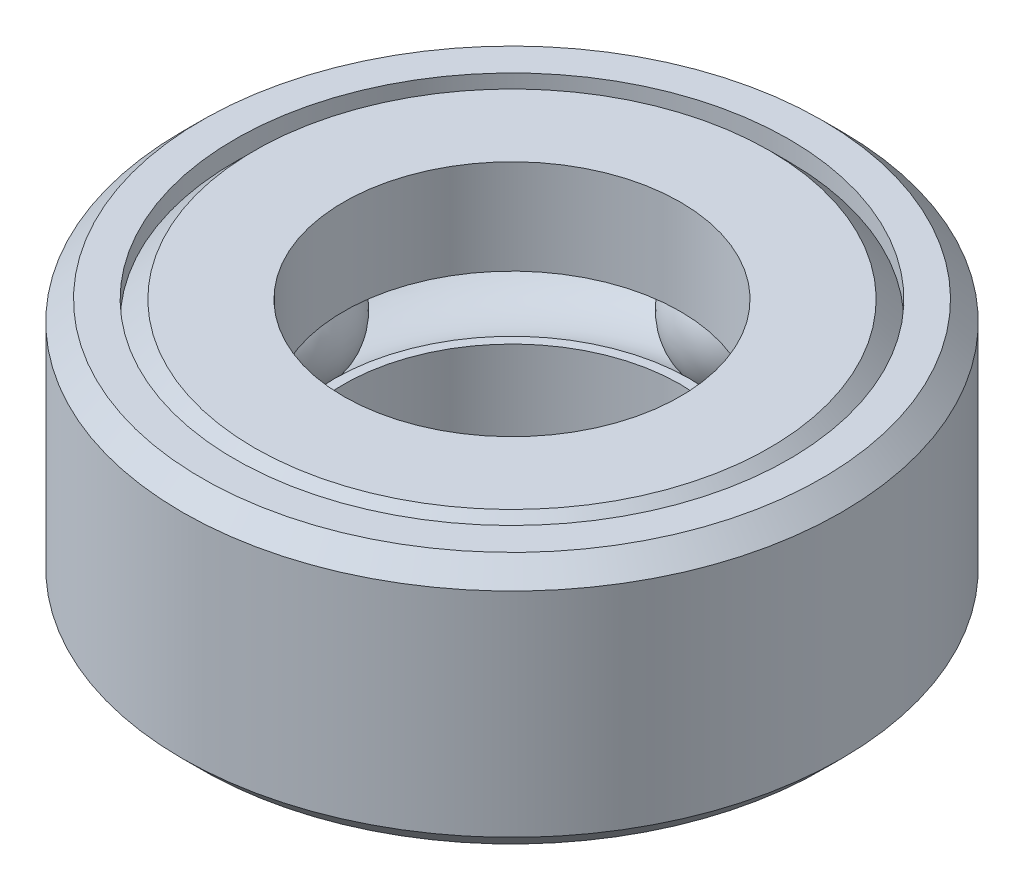
ISO-10303-21;
HEADER;
FILE_DESCRIPTION(('STEP AP214'),'2;1');
FILE_NAME('part.step','',(''),(''),'','','');
FILE_SCHEMA(('AUTOMOTIVE_DESIGN { 1 0 10303 214 1 1 1 1 }'));
ENDSEC;
DATA;
#1=APPLICATION_CONTEXT('core data for automotive mechanical design processes');
#2=APPLICATION_PROTOCOL_DEFINITION('international standard','automotive_design',2000,#1);
#3=PRODUCT_CONTEXT('',#1,'mechanical');
#4=PRODUCT('Part','Part','',(#3));
#5=PRODUCT_RELATED_PRODUCT_CATEGORY('part','',(#4));
#6=PRODUCT_DEFINITION_FORMATION('','',#4);
#7=PRODUCT_DEFINITION_CONTEXT('part definition',#1,'design');
#8=PRODUCT_DEFINITION('design','',#6,#7);
#9=PRODUCT_DEFINITION_SHAPE('','',#8);
#10=(LENGTH_UNIT() NAMED_UNIT(*) SI_UNIT(.MILLI.,.METRE.));
#11=(NAMED_UNIT(*) PLANE_ANGLE_UNIT() SI_UNIT($,.RADIAN.));
#12=(NAMED_UNIT(*) SI_UNIT($,.STERADIAN.) SOLID_ANGLE_UNIT());
#13=UNCERTAINTY_MEASURE_WITH_UNIT(LENGTH_MEASURE(1.E-05),#10,'distance_accuracy_value','');
#14=(GEOMETRIC_REPRESENTATION_CONTEXT(3) GLOBAL_UNCERTAINTY_ASSIGNED_CONTEXT((#13)) GLOBAL_UNIT_ASSIGNED_CONTEXT((#10,
#11,#12)) REPRESENTATION_CONTEXT('',''));
#15=CARTESIAN_POINT('',(0.,0.,0.));
#16=DIRECTION('',(0.,0.,1.));
#17=DIRECTION('',(1.,0.,0.));
#18=AXIS2_PLACEMENT_3D('',#15,#16,#17);
#19=CARTESIAN_POINT('',(13.15640625,0.,1.37806040724343E-13));
#20=DIRECTION('',(0.,1.,0.));
#21=DIRECTION('',(-1.,0.,0.));
#22=AXIS2_PLACEMENT_3D('',#19,#20,#21);
#23=SPHERICAL_SURFACE('',#22,3.571875);
#24=CARTESIAN_POINT('',(13.15640625,3.571875,1.38243469252913E-13));
#25=VERTEX_POINT('',#24);
#26=VERTEX_LOOP('',#25);
#27=FACE_BOUND('',#26,.T.);
#28=ADVANCED_FACE('F44',(#27),#23,.T.);
#29=CLOSED_SHELL('',(#28));
#30=MANIFOLD_SOLID_BREP('B2',#29);
#31=CARTESIAN_POINT('',(0.,0.,-13.15640625));
#32=DIRECTION('',(0.,1.,0.));
#33=DIRECTION('',(0.,0.,1.));
#34=AXIS2_PLACEMENT_3D('',#31,#32,#33);
#35=SPHERICAL_SURFACE('',#34,3.571875);
#36=CARTESIAN_POINT('',(0.,3.571875,-13.15640625));
#37=VERTEX_POINT('',#36);
#38=VERTEX_LOOP('',#37);
#39=FACE_BOUND('',#38,.T.);
#40=ADVANCED_FACE('F63',(#39),#35,.T.);
#41=CLOSED_SHELL('',(#40));
#42=MANIFOLD_SOLID_BREP('B6',#41);
#43=CARTESIAN_POINT('',(-13.15640625,0.,0.));
#44=DIRECTION('',(0.,1.,0.));
#45=DIRECTION('',(1.,0.,0.));
#46=AXIS2_PLACEMENT_3D('',#43,#44,#45);
#47=SPHERICAL_SURFACE('',#46,3.571875);
#48=CARTESIAN_POINT('',(-13.15640625,3.571875,0.));
#49=VERTEX_POINT('',#48);
#50=VERTEX_LOOP('',#49);
#51=FACE_BOUND('',#50,.T.);
#52=ADVANCED_FACE('F82',(#51),#47,.T.);
#53=CLOSED_SHELL('',(#52));
#54=MANIFOLD_SOLID_BREP('B40',#53);
#55=CARTESIAN_POINT('',(0.,0.,13.15640625));
#56=DIRECTION('',(0.,1.,0.));
#57=DIRECTION('',(0.,0.,-1.));
#58=AXIS2_PLACEMENT_3D('',#55,#56,#57);
#59=SPHERICAL_SURFACE('',#58,3.571875);
#60=CARTESIAN_POINT('',(0.,3.571875,13.15640625));
#61=VERTEX_POINT('',#60);
#62=VERTEX_LOOP('',#61);
#63=FACE_BOUND('',#62,.T.);
#64=ADVANCED_FACE('F103',(#63),#59,.T.);
#65=CLOSED_SHELL('',(#64));
#66=MANIFOLD_SOLID_BREP('B59',#65);
#67=CARTESIAN_POINT('',(0.,4.92447139784791,0.));
#68=DIRECTION('',(0.,-1.,0.));
#69=DIRECTION('',(0.,0.,-1.));
#70=AXIS2_PLACEMENT_3D('',#67,#68,#69);
#71=CONICAL_SURFACE('',#70,16.7878125,0.78539816339745);
#72=CARTESIAN_POINT('',(0.,6.03411069892395,0.));
#73=DIRECTION('',(0.,-1.,0.));
#74=DIRECTION('',(0.,0.,-1.));
#75=AXIS2_PLACEMENT_3D('',#72,#73,#74);
#76=CIRCLE('',#75,15.678173198924);
#77=CARTESIAN_POINT('',(0.,6.03411069892396,-15.678173198924));
#78=VERTEX_POINT('',#77);
#79=EDGE_CURVE('E102',#78,#78,#76,.T.);
#80=ORIENTED_EDGE('',*,*,#79,.F.);
#81=EDGE_LOOP('',(#80));
#82=FACE_BOUND('',#81,.T.);
#83=CARTESIAN_POINT('',(0.,4.92447139784791,0.));
#84=DIRECTION('',(0.,-1.,0.));
#85=DIRECTION('',(0.,0.,-1.));
#86=AXIS2_PLACEMENT_3D('',#83,#84,#85);
#87=CIRCLE('',#86,16.7878125);
#88=CARTESIAN_POINT('',(0.,4.92447139784791,-16.7878125));
#89=VERTEX_POINT('',#88);
#90=EDGE_CURVE('E167',#89,#89,#87,.T.);
#91=ORIENTED_EDGE('',*,*,#90,.T.);
#92=EDGE_LOOP('',(#91));
#93=FACE_BOUND('',#92,.T.);
#94=ADVANCED_FACE('F124',(#82,#93),#71,.F.);
#95=CARTESIAN_POINT('',(0.,-7.14375000000001,0.));
#96=DIRECTION('',(0.,-1.,0.));
#97=DIRECTION('',(0.,0.,-1.));
#98=AXIS2_PLACEMENT_3D('',#95,#96,#97);
#99=CYLINDRICAL_SURFACE('',#98,15.678173198924);
#100=CARTESIAN_POINT('',(0.,7.14375,0.));
#101=DIRECTION('',(0.,-1.,0.));
#102=DIRECTION('',(0.,0.,-1.));
#103=AXIS2_PLACEMENT_3D('',#100,#101,#102);
#104=CIRCLE('',#103,15.6781731989239);
#105=CARTESIAN_POINT('',(0.,7.14375,-15.6781731989239));
#106=VERTEX_POINT('',#105);
#107=EDGE_CURVE('E131',#106,#106,#104,.T.);
#108=ORIENTED_EDGE('',*,*,#107,.F.);
#109=EDGE_LOOP('',(#108));
#110=FACE_BOUND('',#109,.T.);
#111=ORIENTED_EDGE('',*,*,#79,.T.);
#112=EDGE_LOOP('',(#111));
#113=FACE_BOUND('',#112,.T.);
#114=ADVANCED_FACE('F217',(#110,#113),#99,.F.);
#115=CARTESIAN_POINT('',(0.,7.14375,17.543485698924));
#116=DIRECTION('',(0.,-1.,0.));
#117=DIRECTION('',(0.,0.,-1.));
#118=AXIS2_PLACEMENT_3D('',#115,#116,#117);
#119=PLANE('',#118);
#120=CARTESIAN_POINT('',(0.,7.14375,0.));
#121=DIRECTION('',(0.,-1.,0.));
#122=DIRECTION('',(0.,0.,-1.));
#123=AXIS2_PLACEMENT_3D('',#120,#121,#122);
#124=CIRCLE('',#123,17.5434856989239);
#125=CARTESIAN_POINT('',(0.,7.14375,-17.5434856989239));
#126=VERTEX_POINT('',#125);
#127=EDGE_CURVE('E136',#126,#126,#124,.T.);
#128=ORIENTED_EDGE('',*,*,#127,.F.);
#129=EDGE_LOOP('',(#128));
#130=FACE_BOUND('',#129,.T.);
#131=ORIENTED_EDGE('',*,*,#107,.T.);
#132=EDGE_LOOP('',(#131));
#133=FACE_BOUND('',#132,.T.);
#134=ADVANCED_FACE('F212',(#130,#133),#119,.F.);
#135=CARTESIAN_POINT('',(0.,7.14375,0.));
#136=DIRECTION('',(0.,-1.,0.));
#137=DIRECTION('',(0.,0.,-1.));
#138=AXIS2_PLACEMENT_3D('',#135,#136,#137);
#139=CONICAL_SURFACE('',#138,17.543485698924,0.785398163397449);
#140=CARTESIAN_POINT('',(0.,6.03411069892395,0.));
#141=DIRECTION('',(0.,-1.,0.));
#142=DIRECTION('',(0.,0.,-1.));
#143=AXIS2_PLACEMENT_3D('',#140,#141,#142);
#144=CIRCLE('',#143,18.653125);
#145=CARTESIAN_POINT('',(0.,6.03411069892396,-18.653125));
#146=VERTEX_POINT('',#145);
#147=EDGE_CURVE('E141',#146,#146,#144,.T.);
#148=ORIENTED_EDGE('',*,*,#147,.F.);
#149=EDGE_LOOP('',(#148));
#150=FACE_BOUND('',#149,.T.);
#151=ORIENTED_EDGE('',*,*,#127,.T.);
#152=EDGE_LOOP('',(#151));
#153=FACE_BOUND('',#152,.T.);
#154=ADVANCED_FACE('F206',(#150,#153),#139,.T.);
#155=CARTESIAN_POINT('',(0.,-7.14375000000001,0.));
#156=DIRECTION('',(0.,-1.,0.));
#157=DIRECTION('',(0.,0.,-1.));
#158=AXIS2_PLACEMENT_3D('',#155,#156,#157);
#159=CYLINDRICAL_SURFACE('',#158,18.653125);
#160=CARTESIAN_POINT('',(0.,-6.03411069892396,0.));
#161=DIRECTION('',(0.,-1.,0.));
#162=DIRECTION('',(0.,0.,-1.));
#163=AXIS2_PLACEMENT_3D('',#160,#161,#162);
#164=CIRCLE('',#163,18.653125);
#165=CARTESIAN_POINT('',(0.,-6.03411069892396,-18.653125));
#166=VERTEX_POINT('',#165);
#167=EDGE_CURVE('E147',#166,#166,#164,.T.);
#168=ORIENTED_EDGE('',*,*,#167,.F.);
#169=EDGE_LOOP('',(#168));
#170=FACE_BOUND('',#169,.T.);
#171=ORIENTED_EDGE('',*,*,#147,.T.);
#172=EDGE_LOOP('',(#171));
#173=FACE_BOUND('',#172,.T.);
#174=ADVANCED_FACE('F200',(#170,#173),#159,.T.);
#175=CARTESIAN_POINT('',(0.,-6.03411069892396,0.));
#176=DIRECTION('',(0.,1.,0.));
#177=DIRECTION('',(0.,0.,1.));
#178=AXIS2_PLACEMENT_3D('',#175,#176,#177);
#179=CONICAL_SURFACE('',#178,18.653125,0.785398163397447);
#180=CARTESIAN_POINT('',(0.,-7.14375000000001,0.));
#181=DIRECTION('',(0.,-1.,0.));
#182=DIRECTION('',(0.,0.,-1.));
#183=AXIS2_PLACEMENT_3D('',#180,#181,#182);
#184=CIRCLE('',#183,17.543485698924);
#185=CARTESIAN_POINT('',(0.,-7.14375000000001,-17.543485698924));
#186=VERTEX_POINT('',#185);
#187=EDGE_CURVE('E151',#186,#186,#184,.T.);
#188=ORIENTED_EDGE('',*,*,#187,.F.);
#189=EDGE_LOOP('',(#188));
#190=FACE_BOUND('',#189,.T.);
#191=ORIENTED_EDGE('',*,*,#167,.T.);
#192=EDGE_LOOP('',(#191));
#193=FACE_BOUND('',#192,.T.);
#194=ADVANCED_FACE('F194',(#190,#193),#179,.T.);
#195=CARTESIAN_POINT('',(0.,-7.14375000000001,17.5434856989239));
#196=DIRECTION('',(0.,1.,0.));
#197=DIRECTION('',(0.,0.,1.));
#198=AXIS2_PLACEMENT_3D('',#195,#196,#197);
#199=PLANE('',#198);
#200=CARTESIAN_POINT('',(0.,-7.14375000000001,0.));
#201=DIRECTION('',(0.,-1.,0.));
#202=DIRECTION('',(0.,0.,-1.));
#203=AXIS2_PLACEMENT_3D('',#200,#201,#202);
#204=CIRCLE('',#203,15.678173198924);
#205=CARTESIAN_POINT('',(0.,-7.14375000000001,-15.678173198924));
#206=VERTEX_POINT('',#205);
#207=EDGE_CURVE('E155',#206,#206,#204,.T.);
#208=ORIENTED_EDGE('',*,*,#207,.F.);
#209=EDGE_LOOP('',(#208));
#210=FACE_BOUND('',#209,.T.);
#211=ORIENTED_EDGE('',*,*,#187,.T.);
#212=EDGE_LOOP('',(#211));
#213=FACE_BOUND('',#212,.T.);
#214=ADVANCED_FACE('F188',(#210,#213),#199,.F.);
#215=CARTESIAN_POINT('',(0.,-7.14375000000001,0.));
#216=DIRECTION('',(0.,-1.,0.));
#217=DIRECTION('',(0.,0.,-1.));
#218=AXIS2_PLACEMENT_3D('',#215,#216,#217);
#219=CYLINDRICAL_SURFACE('',#218,15.6781731989239);
#220=CARTESIAN_POINT('',(0.,-6.03411069892396,0.));
#221=DIRECTION('',(0.,-1.,0.));
#222=DIRECTION('',(0.,0.,-1.));
#223=AXIS2_PLACEMENT_3D('',#220,#221,#222);
#224=CIRCLE('',#223,15.678173198924);
#225=CARTESIAN_POINT('',(0.,-6.03411069892396,-15.678173198924));
#226=VERTEX_POINT('',#225);
#227=EDGE_CURVE('E159',#226,#226,#224,.T.);
#228=ORIENTED_EDGE('',*,*,#227,.F.);
#229=EDGE_LOOP('',(#228));
#230=FACE_BOUND('',#229,.T.);
#231=ORIENTED_EDGE('',*,*,#207,.T.);
#232=EDGE_LOOP('',(#231));
#233=FACE_BOUND('',#232,.T.);
#234=ADVANCED_FACE('F182',(#230,#233),#219,.F.);
#235=CARTESIAN_POINT('',(0.,-6.03411069892396,0.));
#236=DIRECTION('',(0.,1.,0.));
#237=DIRECTION('',(0.,0.,1.));
#238=AXIS2_PLACEMENT_3D('',#235,#236,#237);
#239=CONICAL_SURFACE('',#238,15.6781731989239,0.78539816339745);
#240=CARTESIAN_POINT('',(0.,-4.92447139784791,0.));
#241=DIRECTION('',(0.,-1.,0.));
#242=DIRECTION('',(0.,0.,-1.));
#243=AXIS2_PLACEMENT_3D('',#240,#241,#242);
#244=CIRCLE('',#243,16.7878125);
#245=CARTESIAN_POINT('',(0.,-4.92447139784791,-16.7878125));
#246=VERTEX_POINT('',#245);
#247=EDGE_CURVE('E163',#246,#246,#244,.T.);
#248=ORIENTED_EDGE('',*,*,#247,.F.);
#249=EDGE_LOOP('',(#248));
#250=FACE_BOUND('',#249,.T.);
#251=ORIENTED_EDGE('',*,*,#227,.T.);
#252=EDGE_LOOP('',(#251));
#253=FACE_BOUND('',#252,.T.);
#254=ADVANCED_FACE('F176',(#250,#253),#239,.F.);
#255=CARTESIAN_POINT('',(0.,-7.14375000000001,0.));
#256=DIRECTION('',(0.,-1.,0.));
#257=DIRECTION('',(0.,0.,-1.));
#258=AXIS2_PLACEMENT_3D('',#255,#256,#257);
#259=CYLINDRICAL_SURFACE('',#258,16.7878125);
#260=ORIENTED_EDGE('',*,*,#90,.F.);
#261=EDGE_LOOP('',(#260));
#262=FACE_BOUND('',#261,.T.);
#263=ORIENTED_EDGE('',*,*,#247,.T.);
#264=EDGE_LOOP('',(#263));
#265=FACE_BOUND('',#264,.T.);
#266=ADVANCED_FACE('F173',(#262,#265),#259,.F.);
#267=CLOSED_SHELL('',(#94,#114,#134,#154,#174,#194,#214,#234,#254,#266));
#268=MANIFOLD_SOLID_BREP('B78',#267);
#269=CARTESIAN_POINT('',(0.,0.,0.));
#270=DIRECTION('',(0.,-1.,0.));
#271=DIRECTION('',(0.,0.,-1.));
#272=AXIS2_PLACEMENT_3D('',#269,#270,#271);
#273=TOROIDAL_SURFACE('',#272,13.15640625,3.57187500000001);
#274=CARTESIAN_POINT('',(0.,-1.78593750000001,0.));
#275=DIRECTION('',(0.,-1.,0.));
#276=DIRECTION('',(0.,0.,-1.));
#277=AXIS2_PLACEMENT_3D('',#274,#275,#276);
#278=CIRCLE('',#277,16.2497407391425);
#279=CARTESIAN_POINT('',(0.,-1.78593750000001,-16.2497407391425));
#280=VERTEX_POINT('',#279);
#281=EDGE_CURVE('E123',#280,#280,#278,.T.);
#282=ORIENTED_EDGE('',*,*,#281,.F.);
#283=EDGE_LOOP('',(#282));
#284=FACE_BOUND('',#283,.T.);
#285=CARTESIAN_POINT('',(0.,-1.78593750000001,0.));
#286=DIRECTION('',(0.,-1.,0.));
#287=DIRECTION('',(0.,0.,-1.));
#288=AXIS2_PLACEMENT_3D('',#285,#286,#287);
#289=CIRCLE('',#288,10.0630717608575);
#290=CARTESIAN_POINT('',(0.,-1.78593750000001,-10.0630717608575));
#291=VERTEX_POINT('',#290);
#292=EDGE_CURVE('E318',#291,#291,#289,.T.);
#293=ORIENTED_EDGE('',*,*,#292,.T.);
#294=EDGE_LOOP('',(#293));
#295=FACE_BOUND('',#294,.T.);
#296=ADVANCED_FACE('F293',(#284,#295),#273,.F.);
#297=CARTESIAN_POINT('',(0.,-1.78593750000001,16.2497407391425));
#298=DIRECTION('',(0.,-1.,0.));
#299=DIRECTION('',(0.,0.,-1.));
#300=AXIS2_PLACEMENT_3D('',#297,#298,#299);
#301=PLANE('',#300);
#302=CARTESIAN_POINT('',(0.,-1.78593750000001,0.));
#303=DIRECTION('',(0.,-1.,0.));
#304=DIRECTION('',(0.,0.,-1.));
#305=AXIS2_PLACEMENT_3D('',#302,#303,#304);
#306=CIRCLE('',#305,16.7878125);
#307=CARTESIAN_POINT('',(0.,-1.78593750000001,-16.7878125));
#308=VERTEX_POINT('',#307);
#309=EDGE_CURVE('E299',#308,#308,#306,.T.);
#310=ORIENTED_EDGE('',*,*,#309,.F.);
#311=EDGE_LOOP('',(#310));
#312=FACE_BOUND('',#311,.T.);
#313=ORIENTED_EDGE('',*,*,#281,.T.);
#314=EDGE_LOOP('',(#313));
#315=FACE_BOUND('',#314,.T.);
#316=ADVANCED_FACE('F349',(#312,#315),#301,.F.);
#317=CARTESIAN_POINT('',(0.,-7.14375000000001,0.));
#318=DIRECTION('',(0.,-1.,0.));
#319=DIRECTION('',(0.,0.,-1.));
#320=AXIS2_PLACEMENT_3D('',#317,#318,#319);
#321=CYLINDRICAL_SURFACE('',#320,16.7878125);
#322=CARTESIAN_POINT('',(0.,-4.92447139784792,0.));
#323=DIRECTION('',(0.,-1.,0.));
#324=DIRECTION('',(0.,0.,-1.));
#325=AXIS2_PLACEMENT_3D('',#322,#323,#324);
#326=CIRCLE('',#325,16.7878125);
#327=CARTESIAN_POINT('',(0.,-4.92447139784791,-16.7878125));
#328=VERTEX_POINT('',#327);
#329=EDGE_CURVE('E303',#328,#328,#326,.T.);
#330=ORIENTED_EDGE('',*,*,#329,.F.);
#331=EDGE_LOOP('',(#330));
#332=FACE_BOUND('',#331,.T.);
#333=ORIENTED_EDGE('',*,*,#309,.T.);
#334=EDGE_LOOP('',(#333));
#335=FACE_BOUND('',#334,.T.);
#336=ADVANCED_FACE('F344',(#332,#335),#321,.T.);
#337=CARTESIAN_POINT('',(0.,-4.92447139784792,0.));
#338=DIRECTION('',(0.,1.,0.));
#339=DIRECTION('',(0.,0.,1.));
#340=AXIS2_PLACEMENT_3D('',#337,#338,#339);
#341=CONICAL_SURFACE('',#340,16.7878125,0.78539816339745);
#342=CARTESIAN_POINT('',(0.,-7.14375000000001,0.));
#343=DIRECTION('',(0.,-1.,0.));
#344=DIRECTION('',(0.,0.,-1.));
#345=AXIS2_PLACEMENT_3D('',#342,#343,#344);
#346=CIRCLE('',#345,14.5685338978479);
#347=CARTESIAN_POINT('',(0.,-7.14375000000001,-14.5685338978479));
#348=VERTEX_POINT('',#347);
#349=EDGE_CURVE('E307',#348,#348,#346,.T.);
#350=ORIENTED_EDGE('',*,*,#349,.F.);
#351=EDGE_LOOP('',(#350));
#352=FACE_BOUND('',#351,.T.);
#353=ORIENTED_EDGE('',*,*,#329,.T.);
#354=EDGE_LOOP('',(#353));
#355=FACE_BOUND('',#354,.T.);
#356=ADVANCED_FACE('F338',(#352,#355),#341,.T.);
#357=CARTESIAN_POINT('',(0.,-7.14375000000001,14.5685338978479));
#358=DIRECTION('',(0.,1.,0.));
#359=DIRECTION('',(0.,0.,1.));
#360=AXIS2_PLACEMENT_3D('',#357,#358,#359);
#361=PLANE('',#360);
#362=CARTESIAN_POINT('',(0.,-7.14375,0.));
#363=DIRECTION('',(0.,-1.,0.));
#364=DIRECTION('',(0.,0.,-1.));
#365=AXIS2_PLACEMENT_3D('',#362,#363,#364);
#366=CIRCLE('',#365,9.525);
#367=CARTESIAN_POINT('',(0.,-7.14375,-9.525));
#368=VERTEX_POINT('',#367);
#369=EDGE_CURVE('E312',#368,#368,#366,.T.);
#370=ORIENTED_EDGE('',*,*,#369,.F.);
#371=EDGE_LOOP('',(#370));
#372=FACE_BOUND('',#371,.T.);
#373=ORIENTED_EDGE('',*,*,#349,.T.);
#374=EDGE_LOOP('',(#373));
#375=FACE_BOUND('',#374,.T.);
#376=ADVANCED_FACE('F332',(#372,#375),#361,.F.);
#377=CARTESIAN_POINT('',(0.,-7.14375000000001,0.));
#378=DIRECTION('',(0.,-1.,0.));
#379=DIRECTION('',(0.,0.,-1.));
#380=AXIS2_PLACEMENT_3D('',#377,#378,#379);
#381=CYLINDRICAL_SURFACE('',#380,9.525);
#382=CARTESIAN_POINT('',(0.,-1.78593750000001,0.));
#383=DIRECTION('',(0.,-1.,0.));
#384=DIRECTION('',(0.,0.,-1.));
#385=AXIS2_PLACEMENT_3D('',#382,#383,#384);
#386=CIRCLE('',#385,9.525);
#387=CARTESIAN_POINT('',(0.,-1.78593750000001,-9.525));
#388=VERTEX_POINT('',#387);
#389=EDGE_CURVE('E315',#388,#388,#386,.T.);
#390=ORIENTED_EDGE('',*,*,#389,.F.);
#391=EDGE_LOOP('',(#390));
#392=FACE_BOUND('',#391,.T.);
#393=ORIENTED_EDGE('',*,*,#369,.T.);
#394=EDGE_LOOP('',(#393));
#395=FACE_BOUND('',#394,.T.);
#396=ADVANCED_FACE('F326',(#392,#395),#381,.F.);
#397=CARTESIAN_POINT('',(0.,-1.78593750000001,9.525));
#398=DIRECTION('',(0.,-1.,0.));
#399=DIRECTION('',(0.,0.,-1.));
#400=AXIS2_PLACEMENT_3D('',#397,#398,#399);
#401=PLANE('',#400);
#402=ORIENTED_EDGE('',*,*,#292,.F.);
#403=EDGE_LOOP('',(#402));
#404=FACE_BOUND('',#403,.T.);
#405=ORIENTED_EDGE('',*,*,#389,.T.);
#406=EDGE_LOOP('',(#405));
#407=FACE_BOUND('',#406,.T.);
#408=ADVANCED_FACE('F323',(#404,#407),#401,.F.);
#409=CLOSED_SHELL('',(#296,#316,#336,#356,#376,#396,#408));
#410=MANIFOLD_SOLID_BREP('B97',#409);
#411=CARTESIAN_POINT('',(0.,0.,0.));
#412=DIRECTION('',(0.,-1.,0.));
#413=DIRECTION('',(0.,0.,-1.));
#414=AXIS2_PLACEMENT_3D('',#411,#412,#413);
#415=TOROIDAL_SURFACE('',#414,13.15640625,3.571875);
#416=CARTESIAN_POINT('',(0.,1.7859375,0.));
#417=DIRECTION('',(0.,-1.,0.));
#418=DIRECTION('',(0.,0.,-1.));
#419=AXIS2_PLACEMENT_3D('',#416,#417,#418);
#420=CIRCLE('',#419,10.0630717608575);
#421=CARTESIAN_POINT('',(0.,1.7859375,-10.0630717608575));
#422=VERTEX_POINT('',#421);
#423=EDGE_CURVE('E425',#422,#422,#420,.T.);
#424=ORIENTED_EDGE('',*,*,#423,.F.);
#425=EDGE_LOOP('',(#424));
#426=FACE_BOUND('',#425,.T.);
#427=CARTESIAN_POINT('',(0.,1.7859375,0.));
#428=DIRECTION('',(0.,-1.,0.));
#429=DIRECTION('',(0.,0.,-1.));
#430=AXIS2_PLACEMENT_3D('',#427,#428,#429);
#431=CIRCLE('',#430,16.2497407391425);
#432=CARTESIAN_POINT('',(0.,1.7859375,-16.2497407391425));
#433=VERTEX_POINT('',#432);
#434=EDGE_CURVE('E292',#433,#433,#431,.T.);
#435=ORIENTED_EDGE('',*,*,#434,.T.);
#436=EDGE_LOOP('',(#435));
#437=FACE_BOUND('',#436,.T.);
#438=ADVANCED_FACE('F400',(#426,#437),#415,.F.);
#439=CARTESIAN_POINT('',(0.,1.7859375,16.2497407391425));
#440=DIRECTION('',(0.,1.,0.));
#441=DIRECTION('',(0.,0.,1.));
#442=AXIS2_PLACEMENT_3D('',#439,#440,#441);
#443=PLANE('',#442);
#444=ORIENTED_EDGE('',*,*,#434,.F.);
#445=EDGE_LOOP('',(#444));
#446=FACE_BOUND('',#445,.T.);
#447=CARTESIAN_POINT('',(0.,1.7859375,0.));
#448=DIRECTION('',(0.,-1.,0.));
#449=DIRECTION('',(0.,0.,-1.));
#450=AXIS2_PLACEMENT_3D('',#447,#448,#449);
#451=CIRCLE('',#450,16.7878125);
#452=CARTESIAN_POINT('',(0.,1.7859375,-16.7878125));
#453=VERTEX_POINT('',#452);
#454=EDGE_CURVE('E406',#453,#453,#451,.T.);
#455=ORIENTED_EDGE('',*,*,#454,.T.);
#456=EDGE_LOOP('',(#455));
#457=FACE_BOUND('',#456,.T.);
#458=ADVANCED_FACE('F432',(#446,#457),#443,.F.);
#459=CARTESIAN_POINT('',(0.,-7.14375000000001,0.));
#460=DIRECTION('',(0.,-1.,0.));
#461=DIRECTION('',(0.,0.,-1.));
#462=AXIS2_PLACEMENT_3D('',#459,#460,#461);
#463=CYLINDRICAL_SURFACE('',#462,16.7878125);
#464=ORIENTED_EDGE('',*,*,#454,.F.);
#465=EDGE_LOOP('',(#464));
#466=FACE_BOUND('',#465,.T.);
#467=CARTESIAN_POINT('',(0.,4.92447139784791,0.));
#468=DIRECTION('',(0.,-1.,0.));
#469=DIRECTION('',(0.,0.,-1.));
#470=AXIS2_PLACEMENT_3D('',#467,#468,#469);
#471=CIRCLE('',#470,16.7878125);
#472=CARTESIAN_POINT('',(0.,4.92447139784791,-16.7878125));
#473=VERTEX_POINT('',#472);
#474=EDGE_CURVE('E410',#473,#473,#471,.T.);
#475=ORIENTED_EDGE('',*,*,#474,.T.);
#476=EDGE_LOOP('',(#475));
#477=FACE_BOUND('',#476,.T.);
#478=ADVANCED_FACE('F436',(#466,#477),#463,.T.);
#479=CARTESIAN_POINT('',(0.,7.14375,0.));
#480=DIRECTION('',(0.,-1.,0.));
#481=DIRECTION('',(0.,0.,-1.));
#482=AXIS2_PLACEMENT_3D('',#479,#480,#481);
#483=CONICAL_SURFACE('',#482,14.5685338978479,0.78539816339745);
#484=ORIENTED_EDGE('',*,*,#474,.F.);
#485=EDGE_LOOP('',(#484));
#486=FACE_BOUND('',#485,.T.);
#487=CARTESIAN_POINT('',(0.,7.14375,0.));
#488=DIRECTION('',(0.,-1.,0.));
#489=DIRECTION('',(0.,0.,-1.));
#490=AXIS2_PLACEMENT_3D('',#487,#488,#489);
#491=CIRCLE('',#490,14.5685338978479);
#492=CARTESIAN_POINT('',(0.,7.14375,-14.5685338978479));
#493=VERTEX_POINT('',#492);
#494=EDGE_CURVE('E414',#493,#493,#491,.T.);
#495=ORIENTED_EDGE('',*,*,#494,.T.);
#496=EDGE_LOOP('',(#495));
#497=FACE_BOUND('',#496,.T.);
#498=ADVANCED_FACE('F441',(#486,#497),#483,.T.);
#499=CARTESIAN_POINT('',(0.,7.14375,14.5685338978479));
#500=DIRECTION('',(0.,-1.,0.));
#501=DIRECTION('',(0.,0.,-1.));
#502=AXIS2_PLACEMENT_3D('',#499,#500,#501);
#503=PLANE('',#502);
#504=ORIENTED_EDGE('',*,*,#494,.F.);
#505=EDGE_LOOP('',(#504));
#506=FACE_BOUND('',#505,.T.);
#507=CARTESIAN_POINT('',(0.,7.14374999999999,0.));
#508=DIRECTION('',(0.,-1.,0.));
#509=DIRECTION('',(0.,0.,-1.));
#510=AXIS2_PLACEMENT_3D('',#507,#508,#509);
#511=CIRCLE('',#510,9.525);
#512=CARTESIAN_POINT('',(0.,7.14374999999999,-9.525));
#513=VERTEX_POINT('',#512);
#514=EDGE_CURVE('E419',#513,#513,#511,.T.);
#515=ORIENTED_EDGE('',*,*,#514,.T.);
#516=EDGE_LOOP('',(#515));
#517=FACE_BOUND('',#516,.T.);
#518=ADVANCED_FACE('F447',(#506,#517),#503,.F.);
#519=CARTESIAN_POINT('',(0.,-7.14375000000001,0.));
#520=DIRECTION('',(0.,-1.,0.));
#521=DIRECTION('',(0.,0.,-1.));
#522=AXIS2_PLACEMENT_3D('',#519,#520,#521);
#523=CYLINDRICAL_SURFACE('',#522,9.525);
#524=ORIENTED_EDGE('',*,*,#514,.F.);
#525=EDGE_LOOP('',(#524));
#526=FACE_BOUND('',#525,.T.);
#527=CARTESIAN_POINT('',(0.,1.7859375,0.));
#528=DIRECTION('',(0.,-1.,0.));
#529=DIRECTION('',(0.,0.,-1.));
#530=AXIS2_PLACEMENT_3D('',#527,#528,#529);
#531=CIRCLE('',#530,9.525);
#532=CARTESIAN_POINT('',(0.,1.7859375,-9.525));
#533=VERTEX_POINT('',#532);
#534=EDGE_CURVE('E422',#533,#533,#531,.T.);
#535=ORIENTED_EDGE('',*,*,#534,.T.);
#536=EDGE_LOOP('',(#535));
#537=FACE_BOUND('',#536,.T.);
#538=ADVANCED_FACE('F451',(#526,#537),#523,.F.);
#539=CARTESIAN_POINT('',(0.,1.7859375,9.525));
#540=DIRECTION('',(0.,1.,0.));
#541=DIRECTION('',(0.,0.,1.));
#542=AXIS2_PLACEMENT_3D('',#539,#540,#541);
#543=PLANE('',#542);
#544=ORIENTED_EDGE('',*,*,#534,.F.);
#545=EDGE_LOOP('',(#544));
#546=FACE_BOUND('',#545,.T.);
#547=ORIENTED_EDGE('',*,*,#423,.T.);
#548=EDGE_LOOP('',(#547));
#549=FACE_BOUND('',#548,.T.);
#550=ADVANCED_FACE('F429',(#546,#549),#543,.F.);
#551=CLOSED_SHELL('',(#438,#458,#478,#498,#518,#538,#550));
#552=MANIFOLD_SOLID_BREP('B118',#551);
#553=ADVANCED_BREP_SHAPE_REPRESENTATION('',(#18,#30,#42,#54,#66,#268,#410,#552),#14);
#554=SHAPE_DEFINITION_REPRESENTATION(#9,#553);
ENDSEC;
END-ISO-10303-21;
